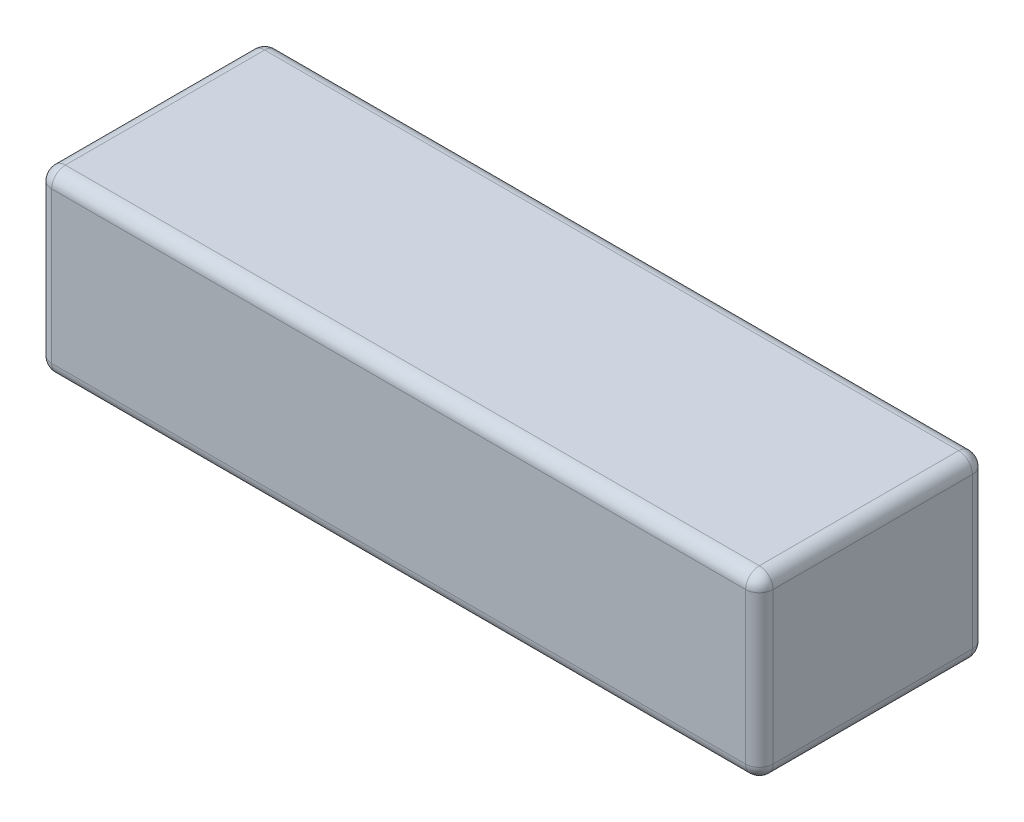
ISO-10303-21;
HEADER;
FILE_DESCRIPTION(('STEP AP214'),'2;1');
FILE_NAME('part.step','',(''),(''),'','','');
FILE_SCHEMA(('AUTOMOTIVE_DESIGN { 1 0 10303 214 1 1 1 1 }'));
ENDSEC;
DATA;
#1=APPLICATION_CONTEXT('core data for automotive mechanical design processes');
#2=APPLICATION_PROTOCOL_DEFINITION('international standard','automotive_design',2000,#1);
#3=PRODUCT_CONTEXT('',#1,'mechanical');
#4=PRODUCT('Part','Part','',(#3));
#5=PRODUCT_RELATED_PRODUCT_CATEGORY('part','',(#4));
#6=PRODUCT_DEFINITION_FORMATION('','',#4);
#7=PRODUCT_DEFINITION_CONTEXT('part definition',#1,'design');
#8=PRODUCT_DEFINITION('design','',#6,#7);
#9=PRODUCT_DEFINITION_SHAPE('','',#8);
#10=(LENGTH_UNIT() NAMED_UNIT(*) SI_UNIT(.MILLI.,.METRE.));
#11=(NAMED_UNIT(*) PLANE_ANGLE_UNIT() SI_UNIT($,.RADIAN.));
#12=(NAMED_UNIT(*) SI_UNIT($,.STERADIAN.) SOLID_ANGLE_UNIT());
#13=UNCERTAINTY_MEASURE_WITH_UNIT(LENGTH_MEASURE(1.E-05),#10,'distance_accuracy_value','');
#14=(GEOMETRIC_REPRESENTATION_CONTEXT(3) GLOBAL_UNCERTAINTY_ASSIGNED_CONTEXT((#13)) GLOBAL_UNIT_ASSIGNED_CONTEXT((#10,
#11,#12)) REPRESENTATION_CONTEXT('',''));
#15=CARTESIAN_POINT('',(0.,0.,0.));
#16=DIRECTION('',(0.,0.,1.));
#17=DIRECTION('',(1.,0.,0.));
#18=AXIS2_PLACEMENT_3D('',#15,#16,#17);
#19=CARTESIAN_POINT('',(52.5,26.,-16.5));
#20=DIRECTION('',(-1.,0.,0.));
#21=DIRECTION('',(0.,0.,1.));
#22=AXIS2_PLACEMENT_3D('',#19,#20,#21);
#23=PLANE('',#22);
#24=DIRECTION('',(0.,-1.,0.));
#25=VECTOR('',#24,1.);
#26=CARTESIAN_POINT('',(52.5,26.,-14.5));
#27=LINE('',#26,#25);
#28=CARTESIAN_POINT('',(52.5,2.,-14.5));
#29=VERTEX_POINT('',#28);
#30=CARTESIAN_POINT('',(52.5,24.,-14.5));
#31=VERTEX_POINT('',#30);
#32=EDGE_CURVE('E218',#29,#31,#27,.F.);
#33=ORIENTED_EDGE('',*,*,#32,.T.);
#34=DIRECTION('',(0.,0.,-1.));
#35=VECTOR('',#34,1.);
#36=CARTESIAN_POINT('',(52.5,24.,16.5));
#37=LINE('',#36,#35);
#38=CARTESIAN_POINT('',(52.5,24.,14.5));
#39=VERTEX_POINT('',#38);
#40=EDGE_CURVE('E226',#31,#39,#37,.F.);
#41=ORIENTED_EDGE('',*,*,#40,.T.);
#42=DIRECTION('',(0.,-1.,0.));
#43=VECTOR('',#42,1.);
#44=CARTESIAN_POINT('',(52.5,26.,14.5));
#45=LINE('',#44,#43);
#46=CARTESIAN_POINT('',(52.5,2.,14.5));
#47=VERTEX_POINT('',#46);
#48=EDGE_CURVE('E215',#39,#47,#45,.T.);
#49=ORIENTED_EDGE('',*,*,#48,.T.);
#50=DIRECTION('',(0.,0.,-1.));
#51=VECTOR('',#50,1.);
#52=CARTESIAN_POINT('',(52.5,2.,-16.5));
#53=LINE('',#52,#51);
#54=EDGE_CURVE('E212',#47,#29,#53,.T.);
#55=ORIENTED_EDGE('',*,*,#54,.T.);
#56=EDGE_LOOP('',(#33,#41,#49,#55));
#57=FACE_BOUND('',#56,.T.);
#58=ADVANCED_FACE('F33',(#57),#23,.F.);
#59=CARTESIAN_POINT('',(-52.5,26.,-16.5));
#60=DIRECTION('',(0.,0.,1.));
#61=DIRECTION('',(1.,0.,0.));
#62=AXIS2_PLACEMENT_3D('',#59,#60,#61);
#63=PLANE('',#62);
#64=DIRECTION('',(0.,-1.,0.));
#65=VECTOR('',#64,1.);
#66=CARTESIAN_POINT('',(-50.5,26.,-16.5));
#67=LINE('',#66,#65);
#68=CARTESIAN_POINT('',(-50.5,2.,-16.5));
#69=VERTEX_POINT('',#68);
#70=CARTESIAN_POINT('',(-50.5,24.,-16.5));
#71=VERTEX_POINT('',#70);
#72=EDGE_CURVE('E273',#69,#71,#67,.F.);
#73=ORIENTED_EDGE('',*,*,#72,.T.);
#74=DIRECTION('',(-1.,0.,0.));
#75=VECTOR('',#74,1.);
#76=CARTESIAN_POINT('',(52.5,24.,-16.5));
#77=LINE('',#76,#75);
#78=CARTESIAN_POINT('',(50.5,24.,-16.5));
#79=VERTEX_POINT('',#78);
#80=EDGE_CURVE('E216',#71,#79,#77,.F.);
#81=ORIENTED_EDGE('',*,*,#80,.T.);
#82=DIRECTION('',(0.,-1.,0.));
#83=VECTOR('',#82,1.);
#84=CARTESIAN_POINT('',(50.5,26.,-16.5));
#85=LINE('',#84,#83);
#86=CARTESIAN_POINT('',(50.5,2.,-16.5));
#87=VERTEX_POINT('',#86);
#88=EDGE_CURVE('E221',#79,#87,#85,.T.);
#89=ORIENTED_EDGE('',*,*,#88,.T.);
#90=DIRECTION('',(-1.,0.,0.));
#91=VECTOR('',#90,1.);
#92=CARTESIAN_POINT('',(-52.5,2.,-16.5));
#93=LINE('',#92,#91);
#94=EDGE_CURVE('E307',#87,#69,#93,.T.);
#95=ORIENTED_EDGE('',*,*,#94,.T.);
#96=EDGE_LOOP('',(#73,#81,#89,#95));
#97=FACE_BOUND('',#96,.T.);
#98=ADVANCED_FACE('F275',(#97),#63,.F.);
#99=CARTESIAN_POINT('',(-52.5,26.,-16.5));
#100=DIRECTION('',(1.,0.,0.));
#101=DIRECTION('',(0.,0.,-1.));
#102=AXIS2_PLACEMENT_3D('',#99,#100,#101);
#103=PLANE('',#102);
#104=DIRECTION('',(0.,0.,1.));
#105=VECTOR('',#104,1.);
#106=CARTESIAN_POINT('',(-52.5,24.,-16.5));
#107=LINE('',#106,#105);
#108=CARTESIAN_POINT('',(-52.5,24.,14.5));
#109=VERTEX_POINT('',#108);
#110=CARTESIAN_POINT('',(-52.5,24.,-14.5));
#111=VERTEX_POINT('',#110);
#112=EDGE_CURVE('E154',#109,#111,#107,.F.);
#113=ORIENTED_EDGE('',*,*,#112,.T.);
#114=DIRECTION('',(0.,-1.,0.));
#115=VECTOR('',#114,1.);
#116=CARTESIAN_POINT('',(-52.5,26.,-14.5));
#117=LINE('',#116,#115);
#118=CARTESIAN_POINT('',(-52.5,2.,-14.5));
#119=VERTEX_POINT('',#118);
#120=EDGE_CURVE('E234',#111,#119,#117,.T.);
#121=ORIENTED_EDGE('',*,*,#120,.T.);
#122=DIRECTION('',(0.,0.,1.));
#123=VECTOR('',#122,1.);
#124=CARTESIAN_POINT('',(-52.5,2.,-16.5));
#125=LINE('',#124,#123);
#126=CARTESIAN_POINT('',(-52.5,2.,14.5));
#127=VERTEX_POINT('',#126);
#128=EDGE_CURVE('E229',#119,#127,#125,.T.);
#129=ORIENTED_EDGE('',*,*,#128,.T.);
#130=DIRECTION('',(0.,-1.,0.));
#131=VECTOR('',#130,1.);
#132=CARTESIAN_POINT('',(-52.5,26.,14.5));
#133=LINE('',#132,#131);
#134=EDGE_CURVE('E231',#127,#109,#133,.F.);
#135=ORIENTED_EDGE('',*,*,#134,.T.);
#136=EDGE_LOOP('',(#113,#121,#129,#135));
#137=FACE_BOUND('',#136,.T.);
#138=ADVANCED_FACE('F288',(#137),#103,.F.);
#139=CARTESIAN_POINT('',(-52.5,26.,16.5));
#140=DIRECTION('',(0.,0.,-1.));
#141=DIRECTION('',(-1.,0.,0.));
#142=AXIS2_PLACEMENT_3D('',#139,#140,#141);
#143=PLANE('',#142);
#144=DIRECTION('',(1.,0.,0.));
#145=VECTOR('',#144,1.);
#146=CARTESIAN_POINT('',(-52.5,24.,16.5));
#147=LINE('',#146,#145);
#148=CARTESIAN_POINT('',(50.5,24.,16.5));
#149=VERTEX_POINT('',#148);
#150=CARTESIAN_POINT('',(-50.5,24.,16.5));
#151=VERTEX_POINT('',#150);
#152=EDGE_CURVE('E241',#149,#151,#147,.F.);
#153=ORIENTED_EDGE('',*,*,#152,.T.);
#154=DIRECTION('',(0.,-1.,0.));
#155=VECTOR('',#154,1.);
#156=CARTESIAN_POINT('',(-50.5,26.,16.5));
#157=LINE('',#156,#155);
#158=CARTESIAN_POINT('',(-50.5,2.,16.5));
#159=VERTEX_POINT('',#158);
#160=EDGE_CURVE('E243',#151,#159,#157,.T.);
#161=ORIENTED_EDGE('',*,*,#160,.T.);
#162=DIRECTION('',(1.,0.,0.));
#163=VECTOR('',#162,1.);
#164=CARTESIAN_POINT('',(-52.5,2.,16.5));
#165=LINE('',#164,#163);
#166=CARTESIAN_POINT('',(50.5,2.,16.5));
#167=VERTEX_POINT('',#166);
#168=EDGE_CURVE('E237',#159,#167,#165,.T.);
#169=ORIENTED_EDGE('',*,*,#168,.T.);
#170=DIRECTION('',(0.,-1.,0.));
#171=VECTOR('',#170,1.);
#172=CARTESIAN_POINT('',(50.5,26.,16.5));
#173=LINE('',#172,#171);
#174=EDGE_CURVE('E239',#167,#149,#173,.F.);
#175=ORIENTED_EDGE('',*,*,#174,.T.);
#176=EDGE_LOOP('',(#153,#161,#169,#175));
#177=FACE_BOUND('',#176,.T.);
#178=ADVANCED_FACE('F295',(#177),#143,.F.);
#179=CARTESIAN_POINT('',(52.5,26.,16.5));
#180=DIRECTION('',(0.,1.,0.));
#181=DIRECTION('',(0.,0.,1.));
#182=AXIS2_PLACEMENT_3D('',#179,#180,#181);
#183=PLANE('',#182);
#184=DIRECTION('',(0.,0.,-1.));
#185=VECTOR('',#184,1.);
#186=CARTESIAN_POINT('',(50.5,26.,-16.5));
#187=LINE('',#186,#185);
#188=CARTESIAN_POINT('',(50.5,26.,14.5));
#189=VERTEX_POINT('',#188);
#190=CARTESIAN_POINT('',(50.5,26.,-14.5));
#191=VERTEX_POINT('',#190);
#192=EDGE_CURVE('E132',#189,#191,#187,.T.);
#193=ORIENTED_EDGE('',*,*,#192,.T.);
#194=DIRECTION('',(-1.,0.,0.));
#195=VECTOR('',#194,1.);
#196=CARTESIAN_POINT('',(-52.5,26.,-14.5));
#197=LINE('',#196,#195);
#198=CARTESIAN_POINT('',(-50.5,26.,-14.5));
#199=VERTEX_POINT('',#198);
#200=EDGE_CURVE('E128',#191,#199,#197,.T.);
#201=ORIENTED_EDGE('',*,*,#200,.T.);
#202=DIRECTION('',(0.,0.,1.));
#203=VECTOR('',#202,1.);
#204=CARTESIAN_POINT('',(-50.5,26.,16.5));
#205=LINE('',#204,#203);
#206=CARTESIAN_POINT('',(-50.5,26.,14.5));
#207=VERTEX_POINT('',#206);
#208=EDGE_CURVE('E122',#199,#207,#205,.T.);
#209=ORIENTED_EDGE('',*,*,#208,.T.);
#210=DIRECTION('',(1.,0.,0.));
#211=VECTOR('',#210,1.);
#212=CARTESIAN_POINT('',(52.5,26.,14.5));
#213=LINE('',#212,#211);
#214=EDGE_CURVE('E125',#207,#189,#213,.T.);
#215=ORIENTED_EDGE('',*,*,#214,.T.);
#216=EDGE_LOOP('',(#193,#201,#209,#215));
#217=FACE_BOUND('',#216,.T.);
#218=ADVANCED_FACE('F124',(#217),#183,.T.);
#219=CARTESIAN_POINT('',(52.5,0.,16.5));
#220=DIRECTION('',(0.,1.,0.));
#221=DIRECTION('',(0.,0.,1.));
#222=AXIS2_PLACEMENT_3D('',#219,#220,#221);
#223=PLANE('',#222);
#224=DIRECTION('',(0.,0.,1.));
#225=VECTOR('',#224,1.);
#226=CARTESIAN_POINT('',(-50.5,0.,16.5));
#227=LINE('',#226,#225);
#228=CARTESIAN_POINT('',(-50.5,0.,14.5));
#229=VERTEX_POINT('',#228);
#230=CARTESIAN_POINT('',(-50.5,0.,-14.5));
#231=VERTEX_POINT('',#230);
#232=EDGE_CURVE('E42',#229,#231,#227,.F.);
#233=ORIENTED_EDGE('',*,*,#232,.T.);
#234=DIRECTION('',(-1.,0.,0.));
#235=VECTOR('',#234,1.);
#236=CARTESIAN_POINT('',(52.5,0.,-14.5));
#237=LINE('',#236,#235);
#238=CARTESIAN_POINT('',(50.5,0.,-14.5));
#239=VERTEX_POINT('',#238);
#240=EDGE_CURVE('E11',#231,#239,#237,.F.);
#241=ORIENTED_EDGE('',*,*,#240,.T.);
#242=DIRECTION('',(0.,0.,-1.));
#243=VECTOR('',#242,1.);
#244=CARTESIAN_POINT('',(50.5,0.,16.5));
#245=LINE('',#244,#243);
#246=CARTESIAN_POINT('',(50.5,0.,14.5));
#247=VERTEX_POINT('',#246);
#248=EDGE_CURVE('E211',#239,#247,#245,.F.);
#249=ORIENTED_EDGE('',*,*,#248,.T.);
#250=DIRECTION('',(1.,0.,0.));
#251=VECTOR('',#250,1.);
#252=CARTESIAN_POINT('',(52.5,0.,14.5));
#253=LINE('',#252,#251);
#254=EDGE_CURVE('E53',#247,#229,#253,.F.);
#255=ORIENTED_EDGE('',*,*,#254,.T.);
#256=EDGE_LOOP('',(#233,#241,#249,#255));
#257=FACE_BOUND('',#256,.T.);
#258=ADVANCED_FACE('F486',(#257),#223,.F.);
#259=CARTESIAN_POINT('',(-52.5,2.,14.5));
#260=DIRECTION('',(1.,0.,0.));
#261=DIRECTION('',(0.,0.,-1.));
#262=AXIS2_PLACEMENT_3D('',#259,#260,#261);
#263=CYLINDRICAL_SURFACE('',#262,2.);
#264=CARTESIAN_POINT('',(50.5,2.,14.5));
#265=DIRECTION('',(1.,0.,0.));
#266=DIRECTION('',(0.,0.,-1.));
#267=AXIS2_PLACEMENT_3D('',#264,#265,#266);
#268=CIRCLE('',#267,2.);
#269=EDGE_CURVE('E37',#167,#247,#268,.T.);
#270=ORIENTED_EDGE('',*,*,#269,.F.);
#271=ORIENTED_EDGE('',*,*,#168,.F.);
#272=CARTESIAN_POINT('',(-50.5,2.,14.5));
#273=DIRECTION('',(-1.,0.,0.));
#274=DIRECTION('',(0.,0.,1.));
#275=AXIS2_PLACEMENT_3D('',#272,#273,#274);
#276=CIRCLE('',#275,2.);
#277=EDGE_CURVE('E192',#229,#159,#276,.T.);
#278=ORIENTED_EDGE('',*,*,#277,.F.);
#279=ORIENTED_EDGE('',*,*,#254,.F.);
#280=EDGE_LOOP('',(#270,#271,#278,#279));
#281=FACE_BOUND('',#280,.T.);
#282=ADVANCED_FACE('F35',(#281),#263,.T.);
#283=CARTESIAN_POINT('',(50.5,2.,14.5));
#284=DIRECTION('',(0.,0.,1.));
#285=DIRECTION('',(1.,0.,0.));
#286=AXIS2_PLACEMENT_3D('',#283,#284,#285);
#287=SPHERICAL_SURFACE('',#286,2.);
#288=CARTESIAN_POINT('',(50.5,2.,14.5));
#289=DIRECTION('',(0.,-1.,0.));
#290=DIRECTION('',(0.,0.,-1.));
#291=AXIS2_PLACEMENT_3D('',#288,#289,#290);
#292=CIRCLE('',#291,2.);
#293=EDGE_CURVE('E187',#167,#47,#292,.F.);
#294=ORIENTED_EDGE('',*,*,#293,.F.);
#295=ORIENTED_EDGE('',*,*,#269,.T.);
#296=CARTESIAN_POINT('',(50.5,2.,14.5));
#297=DIRECTION('',(0.,0.,1.));
#298=DIRECTION('',(1.,0.,0.));
#299=AXIS2_PLACEMENT_3D('',#296,#297,#298);
#300=CIRCLE('',#299,2.);
#301=EDGE_CURVE('E190',#47,#247,#300,.F.);
#302=ORIENTED_EDGE('',*,*,#301,.F.);
#303=EDGE_LOOP('',(#294,#295,#302));
#304=FACE_BOUND('',#303,.T.);
#305=ADVANCED_FACE('F203',(#304),#287,.T.);
#306=CARTESIAN_POINT('',(-50.5,2.,14.5));
#307=DIRECTION('',(0.,0.,1.));
#308=DIRECTION('',(1.,0.,0.));
#309=AXIS2_PLACEMENT_3D('',#306,#307,#308);
#310=SPHERICAL_SURFACE('',#309,2.);
#311=CARTESIAN_POINT('',(-50.5,2.,14.5));
#312=DIRECTION('',(0.,0.,1.));
#313=DIRECTION('',(1.,0.,0.));
#314=AXIS2_PLACEMENT_3D('',#311,#312,#313);
#315=CIRCLE('',#314,2.);
#316=EDGE_CURVE('E182',#229,#127,#315,.F.);
#317=ORIENTED_EDGE('',*,*,#316,.F.);
#318=ORIENTED_EDGE('',*,*,#277,.T.);
#319=CARTESIAN_POINT('',(-50.5,2.,14.5));
#320=DIRECTION('',(0.,-1.,0.));
#321=DIRECTION('',(0.,0.,-1.));
#322=AXIS2_PLACEMENT_3D('',#319,#320,#321);
#323=CIRCLE('',#322,2.);
#324=EDGE_CURVE('E185',#127,#159,#323,.F.);
#325=ORIENTED_EDGE('',*,*,#324,.F.);
#326=EDGE_LOOP('',(#317,#318,#325));
#327=FACE_BOUND('',#326,.T.);
#328=ADVANCED_FACE('F320',(#327),#310,.T.);
#329=CARTESIAN_POINT('',(50.5,2.,-16.5));
#330=DIRECTION('',(0.,0.,-1.));
#331=DIRECTION('',(-1.,0.,0.));
#332=AXIS2_PLACEMENT_3D('',#329,#330,#331);
#333=CYLINDRICAL_SURFACE('',#332,2.);
#334=ORIENTED_EDGE('',*,*,#301,.T.);
#335=ORIENTED_EDGE('',*,*,#248,.F.);
#336=CARTESIAN_POINT('',(50.5,2.,-14.5));
#337=DIRECTION('',(0.,0.,-1.));
#338=DIRECTION('',(-1.,0.,0.));
#339=AXIS2_PLACEMENT_3D('',#336,#337,#338);
#340=CIRCLE('',#339,2.);
#341=EDGE_CURVE('E177',#29,#239,#340,.T.);
#342=ORIENTED_EDGE('',*,*,#341,.F.);
#343=ORIENTED_EDGE('',*,*,#54,.F.);
#344=EDGE_LOOP('',(#334,#335,#342,#343));
#345=FACE_BOUND('',#344,.T.);
#346=ADVANCED_FACE('F209',(#345),#333,.T.);
#347=CARTESIAN_POINT('',(50.5,26.,14.5));
#348=DIRECTION('',(0.,-1.,0.));
#349=DIRECTION('',(0.,0.,-1.));
#350=AXIS2_PLACEMENT_3D('',#347,#348,#349);
#351=CYLINDRICAL_SURFACE('',#350,2.);
#352=ORIENTED_EDGE('',*,*,#293,.T.);
#353=ORIENTED_EDGE('',*,*,#48,.F.);
#354=CARTESIAN_POINT('',(50.5,24.,14.5));
#355=DIRECTION('',(0.,1.,0.));
#356=DIRECTION('',(0.,0.,1.));
#357=AXIS2_PLACEMENT_3D('',#354,#355,#356);
#358=CIRCLE('',#357,2.);
#359=EDGE_CURVE('E174',#149,#39,#358,.T.);
#360=ORIENTED_EDGE('',*,*,#359,.F.);
#361=ORIENTED_EDGE('',*,*,#174,.F.);
#362=EDGE_LOOP('',(#352,#353,#360,#361));
#363=FACE_BOUND('',#362,.T.);
#364=ADVANCED_FACE('F299',(#363),#351,.T.);
#365=CARTESIAN_POINT('',(52.5,24.,14.5));
#366=DIRECTION('',(-1.,0.,0.));
#367=DIRECTION('',(0.,0.,1.));
#368=AXIS2_PLACEMENT_3D('',#365,#366,#367);
#369=CYLINDRICAL_SURFACE('',#368,2.);
#370=CARTESIAN_POINT('',(-50.5,24.,14.5));
#371=DIRECTION('',(-1.,0.,0.));
#372=DIRECTION('',(0.,-1.,0.));
#373=AXIS2_PLACEMENT_3D('',#370,#371,#372);
#374=CIRCLE('',#373,2.);
#375=EDGE_CURVE('E139',#151,#207,#374,.T.);
#376=ORIENTED_EDGE('',*,*,#375,.F.);
#377=ORIENTED_EDGE('',*,*,#152,.F.);
#378=CARTESIAN_POINT('',(50.5,24.,14.5));
#379=DIRECTION('',(1.,0.,0.));
#380=DIRECTION('',(0.,0.,-1.));
#381=AXIS2_PLACEMENT_3D('',#378,#379,#380);
#382=CIRCLE('',#381,2.);
#383=EDGE_CURVE('E142',#189,#149,#382,.T.);
#384=ORIENTED_EDGE('',*,*,#383,.F.);
#385=ORIENTED_EDGE('',*,*,#214,.F.);
#386=EDGE_LOOP('',(#376,#377,#384,#385));
#387=FACE_BOUND('',#386,.T.);
#388=ADVANCED_FACE('F137',(#387),#369,.T.);
#389=CARTESIAN_POINT('',(-50.5,26.,14.5));
#390=DIRECTION('',(0.,-1.,0.));
#391=DIRECTION('',(0.,0.,-1.));
#392=AXIS2_PLACEMENT_3D('',#389,#390,#391);
#393=CYLINDRICAL_SURFACE('',#392,2.);
#394=ORIENTED_EDGE('',*,*,#324,.T.);
#395=ORIENTED_EDGE('',*,*,#160,.F.);
#396=CARTESIAN_POINT('',(-50.5,24.,14.5));
#397=DIRECTION('',(0.,1.,0.));
#398=DIRECTION('',(0.,0.,1.));
#399=AXIS2_PLACEMENT_3D('',#396,#397,#398);
#400=CIRCLE('',#399,2.);
#401=EDGE_CURVE('E151',#109,#151,#400,.T.);
#402=ORIENTED_EDGE('',*,*,#401,.F.);
#403=ORIENTED_EDGE('',*,*,#134,.F.);
#404=EDGE_LOOP('',(#394,#395,#402,#403));
#405=FACE_BOUND('',#404,.T.);
#406=ADVANCED_FACE('F293',(#405),#393,.T.);
#407=CARTESIAN_POINT('',(-50.5,2.,-16.5));
#408=DIRECTION('',(0.,0.,1.));
#409=DIRECTION('',(1.,0.,0.));
#410=AXIS2_PLACEMENT_3D('',#407,#408,#409);
#411=CYLINDRICAL_SURFACE('',#410,2.);
#412=ORIENTED_EDGE('',*,*,#316,.T.);
#413=ORIENTED_EDGE('',*,*,#128,.F.);
#414=CARTESIAN_POINT('',(-50.5,2.,-14.5));
#415=DIRECTION('',(0.,0.,-1.));
#416=DIRECTION('',(-1.,0.,0.));
#417=AXIS2_PLACEMENT_3D('',#414,#415,#416);
#418=CIRCLE('',#417,2.);
#419=EDGE_CURVE('E169',#231,#119,#418,.T.);
#420=ORIENTED_EDGE('',*,*,#419,.F.);
#421=ORIENTED_EDGE('',*,*,#232,.F.);
#422=EDGE_LOOP('',(#412,#413,#420,#421));
#423=FACE_BOUND('',#422,.T.);
#424=ADVANCED_FACE('F319',(#423),#411,.T.);
#425=CARTESIAN_POINT('',(-52.5,2.,-14.5));
#426=DIRECTION('',(-1.,0.,0.));
#427=DIRECTION('',(0.,0.,1.));
#428=AXIS2_PLACEMENT_3D('',#425,#426,#427);
#429=CYLINDRICAL_SURFACE('',#428,2.);
#430=CARTESIAN_POINT('',(50.5,2.,-14.5));
#431=DIRECTION('',(1.,0.,0.));
#432=DIRECTION('',(0.,0.,-1.));
#433=AXIS2_PLACEMENT_3D('',#430,#431,#432);
#434=CIRCLE('',#433,2.);
#435=EDGE_CURVE('E179',#239,#87,#434,.T.);
#436=ORIENTED_EDGE('',*,*,#435,.F.);
#437=ORIENTED_EDGE('',*,*,#240,.F.);
#438=CARTESIAN_POINT('',(-50.5,2.,-14.5));
#439=DIRECTION('',(-1.,0.,0.));
#440=DIRECTION('',(0.,0.,1.));
#441=AXIS2_PLACEMENT_3D('',#438,#439,#440);
#442=CIRCLE('',#441,2.);
#443=EDGE_CURVE('E166',#69,#231,#442,.T.);
#444=ORIENTED_EDGE('',*,*,#443,.F.);
#445=ORIENTED_EDGE('',*,*,#94,.F.);
#446=EDGE_LOOP('',(#436,#437,#444,#445));
#447=FACE_BOUND('',#446,.T.);
#448=ADVANCED_FACE('F314',(#447),#429,.T.);
#449=CARTESIAN_POINT('',(50.5,2.,-14.5));
#450=DIRECTION('',(0.,0.,1.));
#451=DIRECTION('',(1.,0.,0.));
#452=AXIS2_PLACEMENT_3D('',#449,#450,#451);
#453=SPHERICAL_SURFACE('',#452,2.);
#454=ORIENTED_EDGE('',*,*,#341,.T.);
#455=ORIENTED_EDGE('',*,*,#435,.T.);
#456=CARTESIAN_POINT('',(50.5,2.,-14.5));
#457=DIRECTION('',(0.,-1.,0.));
#458=DIRECTION('',(0.,0.,-1.));
#459=AXIS2_PLACEMENT_3D('',#456,#457,#458);
#460=CIRCLE('',#459,2.);
#461=EDGE_CURVE('E158',#29,#87,#460,.F.);
#462=ORIENTED_EDGE('',*,*,#461,.F.);
#463=EDGE_LOOP('',(#454,#455,#462));
#464=FACE_BOUND('',#463,.T.);
#465=ADVANCED_FACE('F356',(#464),#453,.T.);
#466=CARTESIAN_POINT('',(50.5,24.,14.5));
#467=DIRECTION('',(0.,0.,1.));
#468=DIRECTION('',(1.,0.,0.));
#469=AXIS2_PLACEMENT_3D('',#466,#467,#468);
#470=SPHERICAL_SURFACE('',#469,2.);
#471=ORIENTED_EDGE('',*,*,#383,.T.);
#472=ORIENTED_EDGE('',*,*,#359,.T.);
#473=CARTESIAN_POINT('',(50.5,24.,14.5));
#474=DIRECTION('',(0.,0.,1.));
#475=DIRECTION('',(0.,-1.,0.));
#476=AXIS2_PLACEMENT_3D('',#473,#474,#475);
#477=CIRCLE('',#476,2.);
#478=EDGE_CURVE('E155',#189,#39,#477,.F.);
#479=ORIENTED_EDGE('',*,*,#478,.F.);
#480=EDGE_LOOP('',(#471,#472,#479));
#481=FACE_BOUND('',#480,.T.);
#482=ADVANCED_FACE('F301',(#481),#470,.T.);
#483=CARTESIAN_POINT('',(-50.5,24.,14.5));
#484=DIRECTION('',(0.,0.,1.));
#485=DIRECTION('',(1.,0.,0.));
#486=AXIS2_PLACEMENT_3D('',#483,#484,#485);
#487=SPHERICAL_SURFACE('',#486,2.);
#488=ORIENTED_EDGE('',*,*,#401,.T.);
#489=ORIENTED_EDGE('',*,*,#375,.T.);
#490=CARTESIAN_POINT('',(-50.5,24.,14.5));
#491=DIRECTION('',(0.,0.,1.));
#492=DIRECTION('',(1.,0.,0.));
#493=AXIS2_PLACEMENT_3D('',#490,#491,#492);
#494=CIRCLE('',#493,2.);
#495=EDGE_CURVE('E148',#109,#207,#494,.F.);
#496=ORIENTED_EDGE('',*,*,#495,.F.);
#497=EDGE_LOOP('',(#488,#489,#496));
#498=FACE_BOUND('',#497,.T.);
#499=ADVANCED_FACE('F147',(#498),#487,.T.);
#500=CARTESIAN_POINT('',(-50.5,2.,-14.5));
#501=DIRECTION('',(0.,0.,1.));
#502=DIRECTION('',(1.,0.,0.));
#503=AXIS2_PLACEMENT_3D('',#500,#501,#502);
#504=SPHERICAL_SURFACE('',#503,2.);
#505=ORIENTED_EDGE('',*,*,#443,.T.);
#506=ORIENTED_EDGE('',*,*,#419,.T.);
#507=CARTESIAN_POINT('',(-50.5,2.,-14.5));
#508=DIRECTION('',(0.,-1.,0.));
#509=DIRECTION('',(0.,0.,-1.));
#510=AXIS2_PLACEMENT_3D('',#507,#508,#509);
#511=CIRCLE('',#510,2.);
#512=EDGE_CURVE('E156',#69,#119,#511,.F.);
#513=ORIENTED_EDGE('',*,*,#512,.F.);
#514=EDGE_LOOP('',(#505,#506,#513));
#515=FACE_BOUND('',#514,.T.);
#516=ADVANCED_FACE('F317',(#515),#504,.T.);
#517=CARTESIAN_POINT('',(50.5,26.,-14.5));
#518=DIRECTION('',(0.,-1.,0.));
#519=DIRECTION('',(0.,0.,-1.));
#520=AXIS2_PLACEMENT_3D('',#517,#518,#519);
#521=CYLINDRICAL_SURFACE('',#520,2.);
#522=ORIENTED_EDGE('',*,*,#461,.T.);
#523=ORIENTED_EDGE('',*,*,#88,.F.);
#524=CARTESIAN_POINT('',(50.5,24.,-14.5));
#525=DIRECTION('',(0.,1.,0.));
#526=DIRECTION('',(0.,0.,1.));
#527=AXIS2_PLACEMENT_3D('',#524,#525,#526);
#528=CIRCLE('',#527,2.);
#529=EDGE_CURVE('E160',#31,#79,#528,.T.);
#530=ORIENTED_EDGE('',*,*,#529,.F.);
#531=ORIENTED_EDGE('',*,*,#32,.F.);
#532=EDGE_LOOP('',(#522,#523,#530,#531));
#533=FACE_BOUND('',#532,.T.);
#534=ADVANCED_FACE('F270',(#533),#521,.T.);
#535=CARTESIAN_POINT('',(50.5,24.,16.5));
#536=DIRECTION('',(0.,0.,1.));
#537=DIRECTION('',(1.,0.,0.));
#538=AXIS2_PLACEMENT_3D('',#535,#536,#537);
#539=CYLINDRICAL_SURFACE('',#538,2.);
#540=ORIENTED_EDGE('',*,*,#478,.T.);
#541=ORIENTED_EDGE('',*,*,#40,.F.);
#542=CARTESIAN_POINT('',(50.5,24.,-14.5));
#543=DIRECTION('',(0.,0.,-1.));
#544=DIRECTION('',(-1.,0.,0.));
#545=AXIS2_PLACEMENT_3D('',#542,#543,#544);
#546=CIRCLE('',#545,2.);
#547=EDGE_CURVE('E259',#191,#31,#546,.T.);
#548=ORIENTED_EDGE('',*,*,#547,.F.);
#549=ORIENTED_EDGE('',*,*,#192,.F.);
#550=EDGE_LOOP('',(#540,#541,#548,#549));
#551=FACE_BOUND('',#550,.T.);
#552=ADVANCED_FACE('F305',(#551),#539,.T.);
#553=CARTESIAN_POINT('',(-50.5,24.,16.5));
#554=DIRECTION('',(0.,0.,-1.));
#555=DIRECTION('',(-1.,0.,0.));
#556=AXIS2_PLACEMENT_3D('',#553,#554,#555);
#557=CYLINDRICAL_SURFACE('',#556,2.);
#558=ORIENTED_EDGE('',*,*,#495,.T.);
#559=ORIENTED_EDGE('',*,*,#208,.F.);
#560=CARTESIAN_POINT('',(-50.5,24.,-14.5));
#561=DIRECTION('',(0.,0.,-1.));
#562=DIRECTION('',(0.,1.,0.));
#563=AXIS2_PLACEMENT_3D('',#560,#561,#562);
#564=CIRCLE('',#563,2.);
#565=EDGE_CURVE('E256',#111,#199,#564,.T.);
#566=ORIENTED_EDGE('',*,*,#565,.F.);
#567=ORIENTED_EDGE('',*,*,#112,.F.);
#568=EDGE_LOOP('',(#558,#559,#566,#567));
#569=FACE_BOUND('',#568,.T.);
#570=ADVANCED_FACE('F153',(#569),#557,.T.);
#571=CARTESIAN_POINT('',(-50.5,26.,-14.5));
#572=DIRECTION('',(0.,-1.,0.));
#573=DIRECTION('',(0.,0.,-1.));
#574=AXIS2_PLACEMENT_3D('',#571,#572,#573);
#575=CYLINDRICAL_SURFACE('',#574,2.);
#576=ORIENTED_EDGE('',*,*,#512,.T.);
#577=ORIENTED_EDGE('',*,*,#120,.F.);
#578=CARTESIAN_POINT('',(-50.5,24.,-14.5));
#579=DIRECTION('',(0.,1.,0.));
#580=DIRECTION('',(0.,0.,1.));
#581=AXIS2_PLACEMENT_3D('',#578,#579,#580);
#582=CIRCLE('',#581,2.);
#583=EDGE_CURVE('E253',#71,#111,#582,.T.);
#584=ORIENTED_EDGE('',*,*,#583,.F.);
#585=ORIENTED_EDGE('',*,*,#72,.F.);
#586=EDGE_LOOP('',(#576,#577,#584,#585));
#587=FACE_BOUND('',#586,.T.);
#588=ADVANCED_FACE('F285',(#587),#575,.T.);
#589=CARTESIAN_POINT('',(50.5,24.,-14.5));
#590=DIRECTION('',(0.,0.,1.));
#591=DIRECTION('',(1.,0.,0.));
#592=AXIS2_PLACEMENT_3D('',#589,#590,#591);
#593=SPHERICAL_SURFACE('',#592,2.);
#594=ORIENTED_EDGE('',*,*,#547,.T.);
#595=ORIENTED_EDGE('',*,*,#529,.T.);
#596=CARTESIAN_POINT('',(50.5,24.,-14.5));
#597=DIRECTION('',(1.,0.,0.));
#598=DIRECTION('',(0.,0.,-1.));
#599=AXIS2_PLACEMENT_3D('',#596,#597,#598);
#600=CIRCLE('',#599,2.);
#601=EDGE_CURVE('E251',#191,#79,#600,.F.);
#602=ORIENTED_EDGE('',*,*,#601,.F.);
#603=EDGE_LOOP('',(#594,#595,#602));
#604=FACE_BOUND('',#603,.T.);
#605=ADVANCED_FACE('F266',(#604),#593,.T.);
#606=CARTESIAN_POINT('',(-50.5,24.,-14.5));
#607=DIRECTION('',(0.,0.,1.));
#608=DIRECTION('',(1.,0.,0.));
#609=AXIS2_PLACEMENT_3D('',#606,#607,#608);
#610=SPHERICAL_SURFACE('',#609,2.);
#611=ORIENTED_EDGE('',*,*,#583,.T.);
#612=ORIENTED_EDGE('',*,*,#565,.T.);
#613=CARTESIAN_POINT('',(-50.5,24.,-14.5));
#614=DIRECTION('',(-1.,0.,0.));
#615=DIRECTION('',(0.,0.,1.));
#616=AXIS2_PLACEMENT_3D('',#613,#614,#615);
#617=CIRCLE('',#616,2.);
#618=EDGE_CURVE('E249',#71,#199,#617,.F.);
#619=ORIENTED_EDGE('',*,*,#618,.F.);
#620=EDGE_LOOP('',(#611,#612,#619));
#621=FACE_BOUND('',#620,.T.);
#622=ADVANCED_FACE('F282',(#621),#610,.T.);
#623=CARTESIAN_POINT('',(52.5,24.,-14.5));
#624=DIRECTION('',(1.,0.,0.));
#625=DIRECTION('',(0.,0.,-1.));
#626=AXIS2_PLACEMENT_3D('',#623,#624,#625);
#627=CYLINDRICAL_SURFACE('',#626,2.);
#628=ORIENTED_EDGE('',*,*,#601,.T.);
#629=ORIENTED_EDGE('',*,*,#80,.F.);
#630=ORIENTED_EDGE('',*,*,#618,.T.);
#631=ORIENTED_EDGE('',*,*,#200,.F.);
#632=EDGE_LOOP('',(#628,#629,#630,#631));
#633=FACE_BOUND('',#632,.T.);
#634=ADVANCED_FACE('F280',(#633),#627,.T.);
#635=CLOSED_SHELL('',(#58,#98,#138,#178,#218,#258,#282,#305,#328,#346,#364,#388,#406,#424,#448,
#465,#482,#499,#516,#534,#552,#570,#588,#605,#622,#634));
#636=MANIFOLD_SOLID_BREP('B2',#635);
#637=ADVANCED_BREP_SHAPE_REPRESENTATION('',(#18,#636),#14);
#638=SHAPE_DEFINITION_REPRESENTATION(#9,#637);
ENDSEC;
END-ISO-10303-21;
